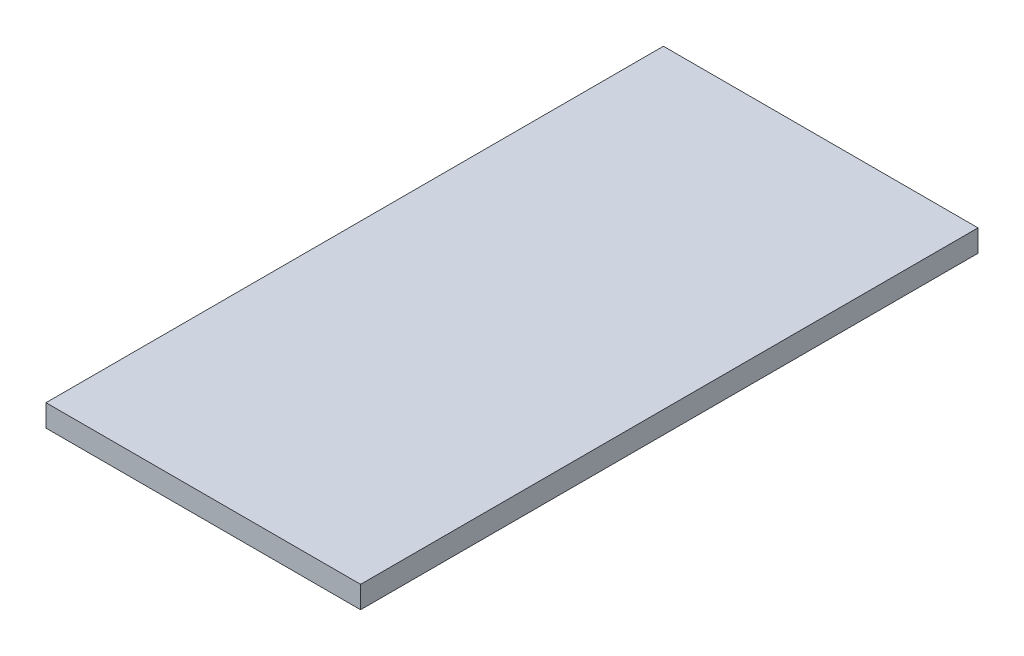
ISO-10303-21;
HEADER;
FILE_DESCRIPTION(('STEP AP214'),'2;1');
FILE_NAME('part.step','',(''),(''),'','','');
FILE_SCHEMA(('AUTOMOTIVE_DESIGN { 1 0 10303 214 1 1 1 1 }'));
ENDSEC;
DATA;
#1=APPLICATION_CONTEXT('core data for automotive mechanical design processes');
#2=APPLICATION_PROTOCOL_DEFINITION('international standard','automotive_design',2000,#1);
#3=PRODUCT_CONTEXT('',#1,'mechanical');
#4=PRODUCT('Part','Part','',(#3));
#5=PRODUCT_RELATED_PRODUCT_CATEGORY('part','',(#4));
#6=PRODUCT_DEFINITION_FORMATION('','',#4);
#7=PRODUCT_DEFINITION_CONTEXT('part definition',#1,'design');
#8=PRODUCT_DEFINITION('design','',#6,#7);
#9=PRODUCT_DEFINITION_SHAPE('','',#8);
#10=(LENGTH_UNIT() NAMED_UNIT(*) SI_UNIT(.MILLI.,.METRE.));
#11=(NAMED_UNIT(*) PLANE_ANGLE_UNIT() SI_UNIT($,.RADIAN.));
#12=(NAMED_UNIT(*) SI_UNIT($,.STERADIAN.) SOLID_ANGLE_UNIT());
#13=UNCERTAINTY_MEASURE_WITH_UNIT(LENGTH_MEASURE(1.E-05),#10,'distance_accuracy_value','');
#14=(GEOMETRIC_REPRESENTATION_CONTEXT(3) GLOBAL_UNCERTAINTY_ASSIGNED_CONTEXT((#13)) GLOBAL_UNIT_ASSIGNED_CONTEXT((#10,
#11,#12)) REPRESENTATION_CONTEXT('',''));
#15=CARTESIAN_POINT('',(0.,0.,0.));
#16=DIRECTION('',(0.,0.,1.));
#17=DIRECTION('',(1.,0.,0.));
#18=AXIS2_PLACEMENT_3D('',#15,#16,#17);
#19=CARTESIAN_POINT('',(-8.631267976045,2.15,0.));
#20=DIRECTION('',(0.,1.,0.));
#21=DIRECTION('',(0.,0.,1.));
#22=AXIS2_PLACEMENT_3D('',#19,#20,#21);
#23=PLANE('',#22);
#24=DIRECTION('',(-1.,0.,0.));
#25=VECTOR('',#24,1.);
#26=CARTESIAN_POINT('',(-8.631267976045,2.15,1.061028939922));
#27=LINE('',#26,#25);
#28=CARTESIAN_POINT('',(0.541435917911,2.15,1.061028939922));
#29=VERTEX_POINT('',#28);
#30=CARTESIAN_POINT('',(0.398808870731,2.15,1.061028939922));
#31=VERTEX_POINT('',#30);
#32=EDGE_CURVE('E79',#29,#31,#27,.T.);
#33=ORIENTED_EDGE('',*,*,#32,.F.);
#34=DIRECTION('',(0.,0.,-1.));
#35=VECTOR('',#34,1.);
#36=CARTESIAN_POINT('',(0.541435917911,2.15,0.));
#37=LINE('',#36,#35);
#38=CARTESIAN_POINT('',(0.541435917911,2.15,1.340943132756));
#39=VERTEX_POINT('',#38);
#40=EDGE_CURVE('E55',#39,#29,#37,.T.);
#41=ORIENTED_EDGE('',*,*,#40,.F.);
#42=DIRECTION('',(1.,0.,0.));
#43=VECTOR('',#42,1.);
#44=CARTESIAN_POINT('',(-8.631267976045,2.15,1.340943132756));
#45=LINE('',#44,#43);
#46=CARTESIAN_POINT('',(0.398808870731,2.15,1.340943132756));
#47=VERTEX_POINT('',#46);
#48=EDGE_CURVE('E57',#47,#39,#45,.T.);
#49=ORIENTED_EDGE('',*,*,#48,.F.);
#50=DIRECTION('',(0.,0.,1.));
#51=VECTOR('',#50,1.);
#52=CARTESIAN_POINT('',(0.398808870731,2.15,0.));
#53=LINE('',#52,#51);
#54=EDGE_CURVE('E20',#31,#47,#53,.T.);
#55=ORIENTED_EDGE('',*,*,#54,.F.);
#56=EDGE_LOOP('',(#33,#41,#49,#55));
#57=FACE_BOUND('',#56,.T.);
#58=ADVANCED_FACE('F17',(#57),#23,.F.);
#59=CARTESIAN_POINT('',(0.398808870731,2.16,0.));
#60=DIRECTION('',(-1.,0.,0.));
#61=DIRECTION('',(0.,0.,1.));
#62=AXIS2_PLACEMENT_3D('',#59,#60,#61);
#63=PLANE('',#62);
#64=DIRECTION('',(0.,0.,1.));
#65=VECTOR('',#64,1.);
#66=CARTESIAN_POINT('',(0.398808870731,2.16,0.));
#67=LINE('',#66,#65);
#68=CARTESIAN_POINT('',(0.398808870731,2.16,1.061028939922));
#69=VERTEX_POINT('',#68);
#70=CARTESIAN_POINT('',(0.398808870731,2.16,1.340943132756));
#71=VERTEX_POINT('',#70);
#72=EDGE_CURVE('E83',#69,#71,#67,.T.);
#73=ORIENTED_EDGE('',*,*,#72,.F.);
#74=DIRECTION('',(0.,1.,0.));
#75=VECTOR('',#74,1.);
#76=CARTESIAN_POINT('',(0.398808870731,2.16,1.061028939922));
#77=LINE('',#76,#75);
#78=EDGE_CURVE('E68',#31,#69,#77,.T.);
#79=ORIENTED_EDGE('',*,*,#78,.F.);
#80=ORIENTED_EDGE('',*,*,#54,.T.);
#81=DIRECTION('',(0.,1.,0.));
#82=VECTOR('',#81,1.);
#83=CARTESIAN_POINT('',(0.398808870731,2.16,1.340943132756));
#84=LINE('',#83,#82);
#85=EDGE_CURVE('E63',#71,#47,#84,.F.);
#86=ORIENTED_EDGE('',*,*,#85,.F.);
#87=EDGE_LOOP('',(#73,#79,#80,#86));
#88=FACE_BOUND('',#87,.T.);
#89=ADVANCED_FACE('F65',(#88),#63,.T.);
#90=CARTESIAN_POINT('',(-8.631267976045,2.16,1.340943132756));
#91=DIRECTION('',(0.,0.,1.));
#92=DIRECTION('',(1.,0.,0.));
#93=AXIS2_PLACEMENT_3D('',#90,#91,#92);
#94=PLANE('',#93);
#95=DIRECTION('',(1.,0.,0.));
#96=VECTOR('',#95,1.);
#97=CARTESIAN_POINT('',(-8.631267976045,2.16,1.340943132756));
#98=LINE('',#97,#96);
#99=CARTESIAN_POINT('',(0.541435917911,2.16,1.340943132756));
#100=VERTEX_POINT('',#99);
#101=EDGE_CURVE('E72',#71,#100,#98,.T.);
#102=ORIENTED_EDGE('',*,*,#101,.F.);
#103=ORIENTED_EDGE('',*,*,#85,.T.);
#104=ORIENTED_EDGE('',*,*,#48,.T.);
#105=DIRECTION('',(0.,1.,0.));
#106=VECTOR('',#105,1.);
#107=CARTESIAN_POINT('',(0.541435917911,2.16,1.340943132756));
#108=LINE('',#107,#106);
#109=EDGE_CURVE('E75',#100,#39,#108,.F.);
#110=ORIENTED_EDGE('',*,*,#109,.F.);
#111=EDGE_LOOP('',(#102,#103,#104,#110));
#112=FACE_BOUND('',#111,.T.);
#113=ADVANCED_FACE('F70',(#112),#94,.T.);
#114=CARTESIAN_POINT('',(0.541435917911,2.16,0.));
#115=DIRECTION('',(1.,0.,0.));
#116=DIRECTION('',(0.,0.,-1.));
#117=AXIS2_PLACEMENT_3D('',#114,#115,#116);
#118=PLANE('',#117);
#119=DIRECTION('',(0.,0.,1.));
#120=VECTOR('',#119,1.);
#121=CARTESIAN_POINT('',(0.541435917911001,2.16,0.));
#122=LINE('',#121,#120);
#123=CARTESIAN_POINT('',(0.541435917911,2.16,1.061028939922));
#124=VERTEX_POINT('',#123);
#125=EDGE_CURVE('E26',#100,#124,#122,.F.);
#126=ORIENTED_EDGE('',*,*,#125,.F.);
#127=ORIENTED_EDGE('',*,*,#109,.T.);
#128=ORIENTED_EDGE('',*,*,#40,.T.);
#129=DIRECTION('',(0.,1.,0.));
#130=VECTOR('',#129,1.);
#131=CARTESIAN_POINT('',(0.541435917911001,2.16,1.061028939922));
#132=LINE('',#131,#130);
#133=EDGE_CURVE('E35',#124,#29,#132,.F.);
#134=ORIENTED_EDGE('',*,*,#133,.F.);
#135=EDGE_LOOP('',(#126,#127,#128,#134));
#136=FACE_BOUND('',#135,.T.);
#137=ADVANCED_FACE('F89',(#136),#118,.T.);
#138=CARTESIAN_POINT('',(-8.631267976045,2.16,1.061028939922));
#139=DIRECTION('',(0.,0.,-1.));
#140=DIRECTION('',(-1.,0.,0.));
#141=AXIS2_PLACEMENT_3D('',#138,#139,#140);
#142=PLANE('',#141);
#143=DIRECTION('',(1.,0.,0.));
#144=VECTOR('',#143,1.);
#145=CARTESIAN_POINT('',(-8.631267976045,2.16,1.061028939922));
#146=LINE('',#145,#144);
#147=EDGE_CURVE('E11',#124,#69,#146,.F.);
#148=ORIENTED_EDGE('',*,*,#147,.F.);
#149=ORIENTED_EDGE('',*,*,#133,.T.);
#150=ORIENTED_EDGE('',*,*,#32,.T.);
#151=ORIENTED_EDGE('',*,*,#78,.T.);
#152=EDGE_LOOP('',(#148,#149,#150,#151));
#153=FACE_BOUND('',#152,.T.);
#154=ADVANCED_FACE('F91',(#153),#142,.T.);
#155=CARTESIAN_POINT('',(-8.631267976045,2.16,0.));
#156=DIRECTION('',(0.,1.,0.));
#157=DIRECTION('',(0.,0.,1.));
#158=AXIS2_PLACEMENT_3D('',#155,#156,#157);
#159=PLANE('',#158);
#160=ORIENTED_EDGE('',*,*,#125,.T.);
#161=ORIENTED_EDGE('',*,*,#147,.T.);
#162=ORIENTED_EDGE('',*,*,#72,.T.);
#163=ORIENTED_EDGE('',*,*,#101,.T.);
#164=EDGE_LOOP('',(#160,#161,#162,#163));
#165=FACE_BOUND('',#164,.T.);
#166=ADVANCED_FACE('F88',(#165),#159,.T.);
#167=CLOSED_SHELL('',(#58,#89,#113,#137,#154,#166));
#168=MANIFOLD_SOLID_BREP('B1',#167);
#169=ADVANCED_BREP_SHAPE_REPRESENTATION('',(#18,#168),#14);
#170=SHAPE_DEFINITION_REPRESENTATION(#9,#169);
ENDSEC;
END-ISO-10303-21;
